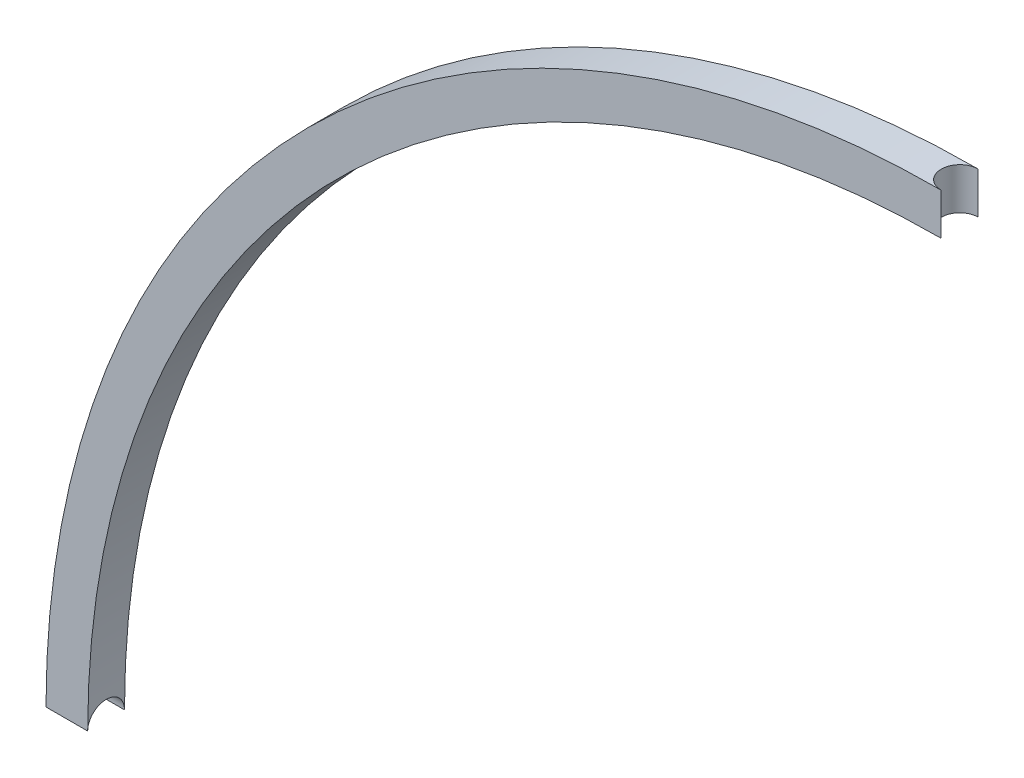
ISO-10303-21;
HEADER;
FILE_DESCRIPTION(('STEP AP214'),'2;1');
FILE_NAME('part.step','',(''),(''),'','','');
FILE_SCHEMA(('AUTOMOTIVE_DESIGN { 1 0 10303 214 1 1 1 1 }'));
ENDSEC;
DATA;
#1=APPLICATION_CONTEXT('core data for automotive mechanical design processes');
#2=APPLICATION_PROTOCOL_DEFINITION('international standard','automotive_design',2000,#1);
#3=PRODUCT_CONTEXT('',#1,'mechanical');
#4=PRODUCT('Part','Part','',(#3));
#5=PRODUCT_RELATED_PRODUCT_CATEGORY('part','',(#4));
#6=PRODUCT_DEFINITION_FORMATION('','',#4);
#7=PRODUCT_DEFINITION_CONTEXT('part definition',#1,'design');
#8=PRODUCT_DEFINITION('design','',#6,#7);
#9=PRODUCT_DEFINITION_SHAPE('','',#8);
#10=(LENGTH_UNIT() NAMED_UNIT(*) SI_UNIT(.MILLI.,.METRE.));
#11=(NAMED_UNIT(*) PLANE_ANGLE_UNIT() SI_UNIT($,.RADIAN.));
#12=(NAMED_UNIT(*) SI_UNIT($,.STERADIAN.) SOLID_ANGLE_UNIT());
#13=UNCERTAINTY_MEASURE_WITH_UNIT(LENGTH_MEASURE(1.E-05),#10,'distance_accuracy_value','');
#14=(GEOMETRIC_REPRESENTATION_CONTEXT(3) GLOBAL_UNCERTAINTY_ASSIGNED_CONTEXT((#13)) GLOBAL_UNIT_ASSIGNED_CONTEXT((#10,
#11,#12)) REPRESENTATION_CONTEXT('',''));
#15=CARTESIAN_POINT('',(0.,0.,0.));
#16=DIRECTION('',(0.,0.,1.));
#17=DIRECTION('',(1.,0.,0.));
#18=AXIS2_PLACEMENT_3D('',#15,#16,#17);
#19=CARTESIAN_POINT('',(0.,0.,6.));
#20=DIRECTION('',(0.,0.,-1.));
#21=DIRECTION('',(-1.,0.,0.));
#22=AXIS2_PLACEMENT_3D('',#19,#20,#21);
#23=CYLINDRICAL_SURFACE('',#22,146.);
#24=CARTESIAN_POINT('',(0.,146.,0.));
#25=CARTESIAN_POINT('',(-0.084368172134654,146.00000071066,-8.09358489239732E-06));
#26=CARTESIAN_POINT('',(-0.168732498072254,145.999926884781,0.00355896478940496));
#27=CARTESIAN_POINT('',(-0.336857402103655,145.999635407456,0.0177807459788106));
#28=CARTESIAN_POINT('',(-0.420618009374803,145.999417763008,0.0284351239147736));
#29=CARTESIAN_POINT('',(-0.586888586383142,145.998844099214,0.0567588384008249));
#30=CARTESIAN_POINT('',(-0.669399403383333,145.998488178412,0.07442317942881));
#31=CARTESIAN_POINT('',(-0.832619196266964,145.997648679811,0.116623375581159));
#32=CARTESIAN_POINT('',(-0.913328193735629,145.997165103543,0.141159148340215));
#33=CARTESIAN_POINT('',(-1.15197057297117,145.995541572587,0.224874069275771));
#34=CARTESIAN_POINT('',(-1.30649040219997,145.994228553585,0.294172990058142));
#35=CARTESIAN_POINT('',(-1.60158641390102,145.991290075927,0.457675981589105));
#36=CARTESIAN_POINT('',(-1.74216528396937,145.989664677672,0.55187523906157));
#37=CARTESIAN_POINT('',(-2.00556080340704,145.986283902307,0.762556580973132));
#38=CARTESIAN_POINT('',(-2.12837472341335,145.984528505287,0.879042083043899));
#39=CARTESIAN_POINT('',(-2.35271731499579,145.981085590207,1.13099373842593));
#40=CARTESIAN_POINT('',(-2.45424274247324,145.979398082522,1.2664627793501));
#41=CARTESIAN_POINT('',(-2.63311503780621,145.976281414928,1.55253253418825));
#42=CARTESIAN_POINT('',(-2.71046083153109,145.974852266498,1.70313391993302));
#43=CARTESIAN_POINT('',(-2.8387642999626,145.97241369173,2.01517801198274));
#44=CARTESIAN_POINT('',(-2.88972368555576,145.971404238182,2.17662001461846));
#45=CARTESIAN_POINT('',(-2.96380962852079,145.96991888641,2.5057503934724));
#46=CARTESIAN_POINT('',(-2.98693959971192,145.969442922744,2.67343800094335));
#47=CARTESIAN_POINT('',(-3.00472056254031,145.9690780171,3.01032079349731));
#48=CARTESIAN_POINT('',(-2.99937092880467,145.969189088012,3.17951601160392));
#49=CARTESIAN_POINT('',(-2.96034657714364,145.969985685179,3.51457854248099));
#50=CARTESIAN_POINT('',(-2.92667642158034,145.970671118906,3.68044638687632));
#51=CARTESIAN_POINT('',(-2.83197391676347,145.97253902018,4.00417412846031));
#52=CARTESIAN_POINT('',(-2.77094164049172,145.973721486402,4.16203404700693));
#53=CARTESIAN_POINT('',(-2.6232407631395,145.976450283013,4.46528325334224));
#54=CARTESIAN_POINT('',(-2.53656952441984,145.977996650835,4.61067125608146));
#55=CARTESIAN_POINT('',(-2.34005722715848,145.981278782529,4.88482749601855));
#56=CARTESIAN_POINT('',(-2.23021727648287,145.983014537343,5.01359652741697));
#57=CARTESIAN_POINT('',(-1.99047778818632,145.986479987629,5.25087684820952));
#58=CARTESIAN_POINT('',(-1.86057723188997,145.98820968279,5.35938710824696));
#59=CARTESIAN_POINT('',(-1.58435024583768,145.991468505006,5.55309441037923));
#60=CARTESIAN_POINT('',(-1.43801861812981,145.992997568259,5.63828404555205));
#61=CARTESIAN_POINT('',(-1.13306422630284,145.995682919557,5.7829273545587));
#62=CARTESIAN_POINT('',(-0.974433999207469,145.996838979027,5.84236525544601));
#63=CARTESIAN_POINT('',(-0.649566789754374,145.998644927479,5.93367332261116));
#64=CARTESIAN_POINT('',(-0.483341831950122,145.999295589119,5.96558557874173));
#65=CARTESIAN_POINT('',(-0.263341709094693,145.99977207673,5.98888862634242));
#66=CARTESIAN_POINT('',(-0.210713391056961,145.999857504289,5.99305758802158));
#67=CARTESIAN_POINT('',(-0.105397159859712,145.999971389794,5.99860947181268));
#68=CARTESIAN_POINT('',(-0.0527094892716581,145.99999994174,5.99999699092553));
#69=CARTESIAN_POINT('',(0.,146.,6.));
#70=B_SPLINE_CURVE_WITH_KNOTS('',3,(#24,#25,#26,#27,#28,#29,#30,#31,#32,#33,#34,#35,#36,#37,#38,
#39,#40,#41,#42,#43,#44,#45,#46,#47,#48,#49,#50,#51,#52,#53,#54,#55,#56,#57,#58,#59,#60,#61,#62,
#63,#64,#65,#66,#67,#68,#69),.UNSPECIFIED.,.F.,.F.,(4,2,2,2,2,2,2,2,2,2,2,2,2,2,2,2,2,2,2,2,2,2,
4),(0.,0.253022169445654,0.506032027369875,0.758861905292901,1.01168875276746,1.51712888524906,
2.02247138667619,2.52789144539892,3.03338846790182,3.53890794288306,4.04439463603237,
4.54981931507759,5.0552550925984,5.56060946132737,6.06596248215435,6.57136750987368,
7.07674837594725,7.5821549136506,8.08772178903444,8.59359788803841,9.09869906640476,
9.2570275309637,9.41509410330506),.UNSPECIFIED.);
#71=CARTESIAN_POINT('',(0.,146.,0.));
#72=VERTEX_POINT('',#71);
#73=CARTESIAN_POINT('',(0.,146.,6.));
#74=VERTEX_POINT('',#73);
#75=EDGE_CURVE('E82',#72,#74,#70,.T.);
#76=ORIENTED_EDGE('',*,*,#75,.F.);
#77=CARTESIAN_POINT('',(0.,0.,0.));
#78=DIRECTION('',(0.,0.,1.));
#79=DIRECTION('',(1.,0.,0.));
#80=AXIS2_PLACEMENT_3D('',#77,#78,#79);
#81=CIRCLE('',#80,146.);
#82=CARTESIAN_POINT('',(-146.,0.,0.));
#83=VERTEX_POINT('',#82);
#84=EDGE_CURVE('E91',#72,#83,#81,.T.);
#85=ORIENTED_EDGE('',*,*,#84,.T.);
#86=CARTESIAN_POINT('',(-146.,0.,0.));
#87=CARTESIAN_POINT('',(-146.00000071066,0.0843681721346542,-8.09358489245168E-06));
#88=CARTESIAN_POINT('',(-145.999926884781,0.168732498072254,0.00355896478940435));
#89=CARTESIAN_POINT('',(-145.999635407456,0.336857402103655,0.0177807459788092));
#90=CARTESIAN_POINT('',(-145.999417763008,0.420618009374803,0.0284351239147719));
#91=CARTESIAN_POINT('',(-145.998844099214,0.586888586383142,0.0567588384008218));
#92=CARTESIAN_POINT('',(-145.998488178412,0.669399403383334,0.0744231794288057));
#93=CARTESIAN_POINT('',(-145.997648679811,0.832619196266965,0.116623375581154));
#94=CARTESIAN_POINT('',(-145.997165103543,0.91332819373563,0.14115914834021));
#95=CARTESIAN_POINT('',(-145.995541572587,1.15197057297117,0.224874069275765));
#96=CARTESIAN_POINT('',(-145.994228553585,1.30649040219997,0.294172990058134));
#97=CARTESIAN_POINT('',(-145.991290075927,1.60158641390102,0.457675981589096));
#98=CARTESIAN_POINT('',(-145.989664677672,1.74216528396938,0.55187523906156));
#99=CARTESIAN_POINT('',(-145.986283902307,2.00556080340704,0.762556580973121));
#100=CARTESIAN_POINT('',(-145.984528505287,2.12837472341336,0.879042083043887));
#101=CARTESIAN_POINT('',(-145.981085590207,2.3527173149958,1.13099373842592));
#102=CARTESIAN_POINT('',(-145.979398082522,2.45424274247325,1.26646277935008));
#103=CARTESIAN_POINT('',(-145.976281414928,2.63311503780622,1.55253253418823));
#104=CARTESIAN_POINT('',(-145.974852266498,2.7104608315311,1.703133919933));
#105=CARTESIAN_POINT('',(-145.97241369173,2.83876429996261,2.01517801198272));
#106=CARTESIAN_POINT('',(-145.971404238182,2.88972368555577,2.17662001461844));
#107=CARTESIAN_POINT('',(-145.96991888641,2.9638096285208,2.50575039347238));
#108=CARTESIAN_POINT('',(-145.969442922744,2.98693959971194,2.67343800094334));
#109=CARTESIAN_POINT('',(-145.9690780171,3.00472056254033,3.01032079349729));
#110=CARTESIAN_POINT('',(-145.969189088012,2.99937092880469,3.1795160116039));
#111=CARTESIAN_POINT('',(-145.969985685179,2.96034657714366,3.51457854248098));
#112=CARTESIAN_POINT('',(-145.970671118906,2.92667642158036,3.6804463868763));
#113=CARTESIAN_POINT('',(-145.97253902018,2.8319739167635,4.0041741284603));
#114=CARTESIAN_POINT('',(-145.973721486402,2.77094164049174,4.16203404700691));
#115=CARTESIAN_POINT('',(-145.976450283013,2.62324076313952,4.46528325334223));
#116=CARTESIAN_POINT('',(-145.977996650835,2.53656952441987,4.61067125608144));
#117=CARTESIAN_POINT('',(-145.981278782529,2.34005722715851,4.88482749601853));
#118=CARTESIAN_POINT('',(-145.983014537343,2.2302172764829,5.01359652741696));
#119=CARTESIAN_POINT('',(-145.986479987629,1.99047778818634,5.25087684820951));
#120=CARTESIAN_POINT('',(-145.98820968279,1.86057723189,5.35938710824695));
#121=CARTESIAN_POINT('',(-145.991468505006,1.58435024583771,5.55309441037922));
#122=CARTESIAN_POINT('',(-145.992997568259,1.43801861812984,5.63828404555204));
#123=CARTESIAN_POINT('',(-145.995682919557,1.13306422630287,5.78292735455869));
#124=CARTESIAN_POINT('',(-145.996838979027,0.974433999207502,5.84236525544601));
#125=CARTESIAN_POINT('',(-145.998644927479,0.649566789754407,5.93367332261115));
#126=CARTESIAN_POINT('',(-145.999295589119,0.483341831950155,5.96558557874173));
#127=CARTESIAN_POINT('',(-145.99977207673,0.263341709094719,5.98888862634242));
#128=CARTESIAN_POINT('',(-145.999857504289,0.21071339105698,5.99305758802158));
#129=CARTESIAN_POINT('',(-145.999971389794,0.105397159859717,5.99860947181268));
#130=CARTESIAN_POINT('',(-145.99999994174,0.052709489271656,5.99999699092553));
#131=CARTESIAN_POINT('',(-146.,0.,6.));
#132=B_SPLINE_CURVE_WITH_KNOTS('',3,(#86,#87,#88,#89,#90,#91,#92,#93,#94,#95,#96,#97,#98,#99,
#100,#101,#102,#103,#104,#105,#106,#107,#108,#109,#110,#111,#112,#113,#114,#115,#116,#117,#118,
#119,#120,#121,#122,#123,#124,#125,#126,#127,#128,#129,#130,#131),.UNSPECIFIED.,.F.,.F.,(4,2,2,
2,2,2,2,2,2,2,2,2,2,2,2,2,2,2,2,2,2,2,4),(0.,0.253022169445654,0.506032027369875,
0.758861905292902,1.01168875276746,1.51712888524906,2.02247138667619,2.52789144539892,
3.03338846790182,3.53890794288306,4.04439463603237,4.54981931507759,5.0552550925984,
5.56060946132737,6.06596248215436,6.57136750987368,7.07674837594725,7.5821549136506,
8.08772178903444,8.59359788803841,9.09869906640476,9.25702753096373,9.4150941033051),.UNSPECIFIED.);
#133=CARTESIAN_POINT('',(-146.,0.,6.));
#134=VERTEX_POINT('',#133);
#135=EDGE_CURVE('E64',#83,#134,#132,.T.);
#136=ORIENTED_EDGE('',*,*,#135,.T.);
#137=CARTESIAN_POINT('',(0.,0.,6.));
#138=DIRECTION('',(0.,0.,1.));
#139=DIRECTION('',(1.,0.,0.));
#140=AXIS2_PLACEMENT_3D('',#137,#138,#139);
#141=CIRCLE('',#140,146.);
#142=EDGE_CURVE('E86',#74,#134,#141,.T.);
#143=ORIENTED_EDGE('',*,*,#142,.F.);
#144=EDGE_LOOP('',(#76,#85,#136,#143));
#145=FACE_BOUND('',#144,.T.);
#146=ADVANCED_FACE('F39',(#145),#23,.T.);
#147=CARTESIAN_POINT('',(0.,0.,6.));
#148=DIRECTION('',(0.,0.,-1.));
#149=DIRECTION('',(-1.,0.,0.));
#150=AXIS2_PLACEMENT_3D('',#147,#148,#149);
#151=CYLINDRICAL_SURFACE('',#150,139.2);
#152=CARTESIAN_POINT('',(0.,139.2,6.));
#153=CARTESIAN_POINT('',(-0.0843672264093701,139.200000745349,6.00000809462385));
#154=CARTESIAN_POINT('',(-0.168730605422514,139.199923314781,5.99644111507861));
#155=CARTESIAN_POINT('',(-0.336853604948091,139.199617605479,5.98221965531329));
#156=CARTESIAN_POINT('',(-0.42061325468478,139.199389334098,5.97156552051647));
#157=CARTESIAN_POINT('',(-0.586881839448697,139.198787660175,5.94324247630207));
#158=CARTESIAN_POINT('',(-0.66939162277633,139.198414361116,5.92557856837696));
#159=CARTESIAN_POINT('',(-0.832609356648109,139.197533872794,5.88337943263883));
#160=CARTESIAN_POINT('',(-0.913317328747631,139.197026685134,5.85884428707522));
#161=CARTESIAN_POINT('',(-1.15195660419095,139.195323882362,5.77513158020491));
#162=CARTESIAN_POINT('',(-1.30647439001647,139.193946752247,5.70583456814362));
#163=CARTESIAN_POINT('',(-1.6015667351152,139.190864789131,5.54233623693776));
#164=CARTESIAN_POINT('',(-1.74214397743673,139.189160019375,5.44813972288549));
#165=CARTESIAN_POINT('',(-2.00553870886164,139.185614115221,5.23746317082701));
#166=CARTESIAN_POINT('',(-2.12835323489599,139.183772958149,5.12097942250987));
#167=CARTESIAN_POINT('',(-2.35269747314538,139.180161818911,4.86903117329186));
#168=CARTESIAN_POINT('',(-2.45422394135821,139.178391847626,4.73356378478949));
#169=CARTESIAN_POINT('',(-2.63309958381089,139.175122840717,4.44749568496378));
#170=CARTESIAN_POINT('',(-2.7104474693597,139.173623819536,4.29689416757364));
#171=CARTESIAN_POINT('',(-2.83875496228736,139.171066003024,3.98484910734633));
#172=CARTESIAN_POINT('',(-2.88971628284821,139.170007179112,3.82340626916503));
#173=CARTESIAN_POINT('',(-2.96380517495548,139.168449176705,3.49427599284735));
#174=CARTESIAN_POINT('',(-2.98693655895624,139.167949921553,3.32658941329359));
#175=CARTESIAN_POINT('',(-3.00472061703028,139.167567115582,2.98970836643774));
#176=CARTESIAN_POINT('',(-2.99937266870946,139.167683578217,2.82051386626186));
#177=CARTESIAN_POINT('',(-2.96035223929174,139.168519024002,2.48545513889114));
#178=CARTESIAN_POINT('',(-2.92668474926726,139.169237900981,2.3195903301408));
#179=CARTESIAN_POINT('',(-2.8319887157263,139.171196962439,1.99586821190115));
#180=CARTESIAN_POINT('',(-2.77096024380654,139.172437145554,1.83801088145951));
#181=CARTESIAN_POINT('',(-2.62326751377779,139.175299160839,1.53476493706742));
#182=CARTESIAN_POINT('',(-2.53660042154568,139.176921035196,1.38937770386921));
#183=CARTESIAN_POINT('',(-2.34009697769498,139.180363443809,1.11522210782897));
#184=CARTESIAN_POINT('',(-2.23026173057109,139.182183968593,0.986452953225335));
#185=CARTESIAN_POINT('',(-1.99052964936522,139.185818718718,0.749168999794197));
#186=CARTESIAN_POINT('',(-1.86063142497422,139.187632943615,0.640655605786887));
#187=CARTESIAN_POINT('',(-1.58440835651933,139.191051047957,0.446941631656568));
#188=CARTESIAN_POINT('',(-1.43807831532204,139.192654860502,0.361748456817725));
#189=CARTESIAN_POINT('',(-1.13312609174071,139.195471516875,0.217097797460578));
#190=CARTESIAN_POINT('',(-0.974496440982487,139.196684120818,0.157656095927003));
#191=CARTESIAN_POINT('',(-0.649629418942721,139.198578438638,0.0663404926402733));
#192=CARTESIAN_POINT('',(-0.483404073131147,139.199260962871,0.0344245028408845));
#193=CARTESIAN_POINT('',(-0.263393039508525,139.199760849277,0.011115713492773));
#194=CARTESIAN_POINT('',(-0.21075449871107,139.199850484942,0.00694512401575055));
#195=CARTESIAN_POINT('',(-0.105417752084814,139.199969980448,0.00139107165208397));
#196=CARTESIAN_POINT('',(-0.0527197889942848,139.199999938926,3.00969573484567E-06));
#197=CARTESIAN_POINT('',(0.,139.2,0.));
#198=B_SPLINE_CURVE_WITH_KNOTS('',3,(#152,#153,#154,#155,#156,#157,#158,#159,#160,#161,#162,
#163,#164,#165,#166,#167,#168,#169,#170,#171,#172,#173,#174,#175,#176,#177,#178,#179,#180,#181,
#182,#183,#184,#185,#186,#187,#188,#189,#190,#191,#192,#193,#194,#195,#196,#197),.UNSPECIFIED.,
.F.,.F.,(4,2,2,2,2,2,2,2,2,2,2,2,2,2,2,2,2,2,2,2,2,2,4),(0.,0.253019329657949,0.50602632822452,
0.758853129236186,1.01167690401487,1.5171107025651,2.02244703389484,2.52786756539197,
3.03336506002377,3.53888949250687,4.04438109904254,4.54980344982629,5.05523684627551,
5.56058118315301,6.06592419768105,6.57132309430454,7.07669790250598,7.5821077475141,
8.08767789861292,8.59355747495517,9.09866216038301,9.25702156514897,9.41511901080502),.UNSPECIFIED.);
#199=CARTESIAN_POINT('',(0.,139.2,6.));
#200=VERTEX_POINT('',#199);
#201=CARTESIAN_POINT('',(0.,139.2,0.));
#202=VERTEX_POINT('',#201);
#203=EDGE_CURVE('E56',#200,#202,#198,.T.);
#204=ORIENTED_EDGE('',*,*,#203,.F.);
#205=CARTESIAN_POINT('',(0.,0.,6.));
#206=DIRECTION('',(0.,0.,-1.));
#207=DIRECTION('',(1.,0.,0.));
#208=AXIS2_PLACEMENT_3D('',#205,#206,#207);
#209=CIRCLE('',#208,139.2);
#210=CARTESIAN_POINT('',(-139.2,0.,6.));
#211=VERTEX_POINT('',#210);
#212=EDGE_CURVE('E48',#211,#200,#209,.T.);
#213=ORIENTED_EDGE('',*,*,#212,.F.);
#214=CARTESIAN_POINT('',(-139.2,0.,6.));
#215=CARTESIAN_POINT('',(-139.200000745349,0.0843672264093788,6.00000809462385));
#216=CARTESIAN_POINT('',(-139.199923314781,0.168730605422523,5.99644111507861));
#217=CARTESIAN_POINT('',(-139.199617605479,0.3368536049481,5.98221965531329));
#218=CARTESIAN_POINT('',(-139.199389334098,0.420613254684789,5.97156552051647));
#219=CARTESIAN_POINT('',(-139.198787660175,0.586881839448706,5.94324247630208));
#220=CARTESIAN_POINT('',(-139.198414361116,0.669391622776339,5.92557856837696));
#221=CARTESIAN_POINT('',(-139.197533872794,0.832609356648118,5.88337943263883));
#222=CARTESIAN_POINT('',(-139.197026685134,0.91331732874764,5.85884428707522));
#223=CARTESIAN_POINT('',(-139.195323882362,1.15195660419096,5.77513158020491));
#224=CARTESIAN_POINT('',(-139.193946752247,1.30647439001648,5.70583456814363));
#225=CARTESIAN_POINT('',(-139.190864789131,1.60156673511521,5.54233623693777));
#226=CARTESIAN_POINT('',(-139.189160019375,1.74214397743674,5.4481397228855));
#227=CARTESIAN_POINT('',(-139.185614115221,2.00553870886166,5.23746317082701));
#228=CARTESIAN_POINT('',(-139.183772958149,2.128353234896,5.12097942250988));
#229=CARTESIAN_POINT('',(-139.180161818911,2.3526974731454,4.86903117329186));
#230=CARTESIAN_POINT('',(-139.178391847626,2.45422394135823,4.7335637847895));
#231=CARTESIAN_POINT('',(-139.175122840717,2.63309958381091,4.44749568496378));
#232=CARTESIAN_POINT('',(-139.173623819536,2.71044746935972,4.29689416757365));
#233=CARTESIAN_POINT('',(-139.171066003024,2.83875496228737,3.98484910734633));
#234=CARTESIAN_POINT('',(-139.170007179112,2.88971628284823,3.82340626916504));
#235=CARTESIAN_POINT('',(-139.168449176705,2.9638051749555,3.49427599284736));
#236=CARTESIAN_POINT('',(-139.167949921553,2.98693655895626,3.3265894132936));
#237=CARTESIAN_POINT('',(-139.167567115582,3.0047206170303,2.98970836643775));
#238=CARTESIAN_POINT('',(-139.167683578217,2.99937266870948,2.82051386626186));
#239=CARTESIAN_POINT('',(-139.168519024002,2.96035223929176,2.48545513889114));
#240=CARTESIAN_POINT('',(-139.169237900981,2.92668474926728,2.31959033014081));
#241=CARTESIAN_POINT('',(-139.171196962439,2.83198871572632,1.99586821190116));
#242=CARTESIAN_POINT('',(-139.172437145554,2.77096024380656,1.83801088145951));
#243=CARTESIAN_POINT('',(-139.175299160839,2.62326751377781,1.53476493706743));
#244=CARTESIAN_POINT('',(-139.176921035196,2.5366004215457,1.38937770386922));
#245=CARTESIAN_POINT('',(-139.180363443809,2.340096977695,1.11522210782898));
#246=CARTESIAN_POINT('',(-139.182183968593,2.23026173057111,0.986452953225341));
#247=CARTESIAN_POINT('',(-139.185818718718,1.99052964936524,0.749168999794201));
#248=CARTESIAN_POINT('',(-139.187632943615,1.86063142497424,0.640655605786892));
#249=CARTESIAN_POINT('',(-139.191051047957,1.58440835651935,0.446941631656572));
#250=CARTESIAN_POINT('',(-139.192654860502,1.43807831532207,0.361748456817729));
#251=CARTESIAN_POINT('',(-139.195471516875,1.13312609174073,0.217097797460581));
#252=CARTESIAN_POINT('',(-139.196684120818,0.97449644098251,0.157656095927006));
#253=CARTESIAN_POINT('',(-139.198578438638,0.649629418942744,0.0663404926402745));
#254=CARTESIAN_POINT('',(-139.199260962871,0.48340407313117,0.034424502840885));
#255=CARTESIAN_POINT('',(-139.199760849277,0.263393039508547,0.0111157134927735));
#256=CARTESIAN_POINT('',(-139.199850484942,0.210754498711091,0.00694512401575115));
#257=CARTESIAN_POINT('',(-139.199969980448,0.105417752084834,0.00139107165208456));
#258=CARTESIAN_POINT('',(-139.199999938926,0.0527197889943032,3.0096957353652E-06));
#259=CARTESIAN_POINT('',(-139.2,0.,0.));
#260=B_SPLINE_CURVE_WITH_KNOTS('',3,(#214,#215,#216,#217,#218,#219,#220,#221,#222,#223,#224,
#225,#226,#227,#228,#229,#230,#231,#232,#233,#234,#235,#236,#237,#238,#239,#240,#241,#242,#243,
#244,#245,#246,#247,#248,#249,#250,#251,#252,#253,#254,#255,#256,#257,#258,#259),.UNSPECIFIED.,
.F.,.F.,(4,2,2,2,2,2,2,2,2,2,2,2,2,2,2,2,2,2,2,2,2,2,4),(0.,0.253019329657949,0.50602632822452,
0.758853129236186,1.01167690401487,1.5171107025651,2.02244703389484,2.52786756539198,
3.03336506002378,3.53888949250687,4.04438109904254,4.54980344982629,5.05523684627551,
5.56058118315301,6.06592419768106,6.57132309430454,7.07669790250598,7.5821077475141,
8.08767789861292,8.59355747495517,9.09866216038302,9.25702156514897,9.41511901080503),.UNSPECIFIED.);
#261=CARTESIAN_POINT('',(-139.2,0.,0.));
#262=VERTEX_POINT('',#261);
#263=EDGE_CURVE('E93',#211,#262,#260,.T.);
#264=ORIENTED_EDGE('',*,*,#263,.T.);
#265=CARTESIAN_POINT('',(0.,0.,0.));
#266=DIRECTION('',(0.,0.,-1.));
#267=DIRECTION('',(1.,0.,0.));
#268=AXIS2_PLACEMENT_3D('',#265,#266,#267);
#269=CIRCLE('',#268,139.2);
#270=EDGE_CURVE('E87',#262,#202,#269,.T.);
#271=ORIENTED_EDGE('',*,*,#270,.T.);
#272=EDGE_LOOP('',(#204,#213,#264,#271));
#273=FACE_BOUND('',#272,.T.);
#274=ADVANCED_FACE('F103',(#273),#151,.F.);
#275=CARTESIAN_POINT('',(0.,0.,6.));
#276=DIRECTION('',(0.,0.,1.));
#277=DIRECTION('',(1.,0.,0.));
#278=AXIS2_PLACEMENT_3D('',#275,#276,#277);
#279=PLANE('',#278);
#280=ORIENTED_EDGE('',*,*,#142,.T.);
#281=DIRECTION('',(1.,0.,0.));
#282=VECTOR('',#281,1.);
#283=CARTESIAN_POINT('',(-139.2,0.,6.));
#284=LINE('',#283,#282);
#285=EDGE_CURVE('E175',#134,#211,#284,.T.);
#286=ORIENTED_EDGE('',*,*,#285,.T.);
#287=ORIENTED_EDGE('',*,*,#212,.T.);
#288=DIRECTION('',(0.,1.,0.));
#289=VECTOR('',#288,1.);
#290=CARTESIAN_POINT('',(0.,139.2,6.));
#291=LINE('',#290,#289);
#292=EDGE_CURVE('E11',#200,#74,#291,.T.);
#293=ORIENTED_EDGE('',*,*,#292,.T.);
#294=EDGE_LOOP('',(#280,#286,#287,#293));
#295=FACE_BOUND('',#294,.T.);
#296=ADVANCED_FACE('F131',(#295),#279,.T.);
#297=CARTESIAN_POINT('',(0.,0.,0.));
#298=DIRECTION('',(0.,0.,1.));
#299=DIRECTION('',(1.,0.,0.));
#300=AXIS2_PLACEMENT_3D('',#297,#298,#299);
#301=PLANE('',#300);
#302=ORIENTED_EDGE('',*,*,#84,.F.);
#303=DIRECTION('',(0.,1.,0.));
#304=VECTOR('',#303,1.);
#305=CARTESIAN_POINT('',(0.,139.2,0.));
#306=LINE('',#305,#304);
#307=EDGE_CURVE('E43',#202,#72,#306,.T.);
#308=ORIENTED_EDGE('',*,*,#307,.F.);
#309=ORIENTED_EDGE('',*,*,#270,.F.);
#310=DIRECTION('',(1.,0.,0.));
#311=VECTOR('',#310,1.);
#312=CARTESIAN_POINT('',(-139.2,0.,0.));
#313=LINE('',#312,#311);
#314=EDGE_CURVE('E96',#83,#262,#313,.T.);
#315=ORIENTED_EDGE('',*,*,#314,.F.);
#316=EDGE_LOOP('',(#302,#308,#309,#315));
#317=FACE_BOUND('',#316,.T.);
#318=ADVANCED_FACE('F95',(#317),#301,.F.);
#319=CARTESIAN_POINT('',(-172.,0.,3.));
#320=DIRECTION('',(1.,0.,0.));
#321=DIRECTION('',(0.,0.,-1.));
#322=AXIS2_PLACEMENT_3D('',#319,#320,#321);
#323=CYLINDRICAL_SURFACE('',#322,3.);
#324=ORIENTED_EDGE('',*,*,#314,.T.);
#325=ORIENTED_EDGE('',*,*,#263,.F.);
#326=ORIENTED_EDGE('',*,*,#285,.F.);
#327=ORIENTED_EDGE('',*,*,#135,.F.);
#328=EDGE_LOOP('',(#324,#325,#326,#327));
#329=FACE_BOUND('',#328,.T.);
#330=ADVANCED_FACE('F126',(#329),#323,.F.);
#331=CARTESIAN_POINT('',(0.,175.,3.));
#332=DIRECTION('',(0.,-1.,0.));
#333=DIRECTION('',(0.,0.,-1.));
#334=AXIS2_PLACEMENT_3D('',#331,#332,#333);
#335=CYLINDRICAL_SURFACE('',#334,3.);
#336=ORIENTED_EDGE('',*,*,#203,.T.);
#337=ORIENTED_EDGE('',*,*,#307,.T.);
#338=ORIENTED_EDGE('',*,*,#75,.T.);
#339=ORIENTED_EDGE('',*,*,#292,.F.);
#340=EDGE_LOOP('',(#336,#337,#338,#339));
#341=FACE_BOUND('',#340,.T.);
#342=ADVANCED_FACE('F81',(#341),#335,.F.);
#343=CLOSED_SHELL('',(#146,#274,#296,#318,#330,#342));
#344=MANIFOLD_SOLID_BREP('B2',#343);
#345=ADVANCED_BREP_SHAPE_REPRESENTATION('',(#18,#344),#14);
#346=SHAPE_DEFINITION_REPRESENTATION(#9,#345);
ENDSEC;
END-ISO-10303-21;
